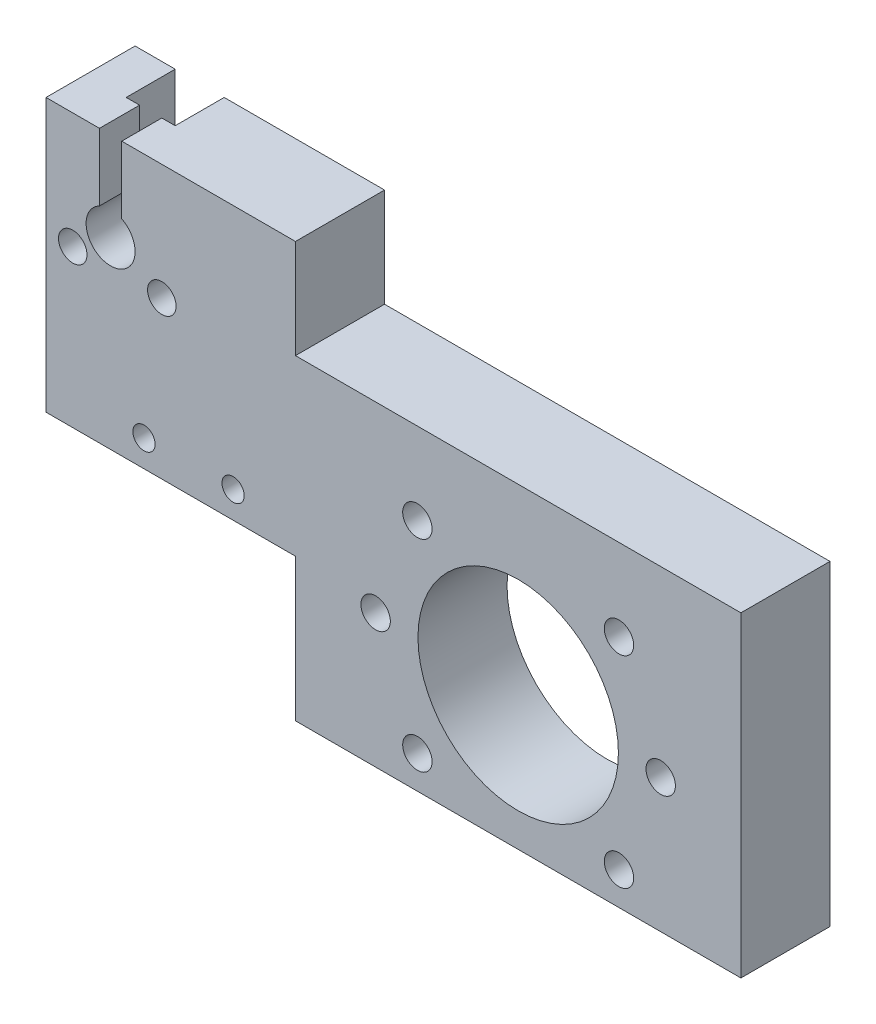
ISO-10303-21;
HEADER;
FILE_DESCRIPTION(('STEP AP214'),'2;1');
FILE_NAME('part.step','',(''),(''),'','','');
FILE_SCHEMA(('AUTOMOTIVE_DESIGN { 1 0 10303 214 1 1 1 1 }'));
ENDSEC;
DATA;
#1=APPLICATION_CONTEXT('core data for automotive mechanical design processes');
#2=APPLICATION_PROTOCOL_DEFINITION('international standard','automotive_design',2000,#1);
#3=PRODUCT_CONTEXT('',#1,'mechanical');
#4=PRODUCT('Part','Part','',(#3));
#5=PRODUCT_RELATED_PRODUCT_CATEGORY('part','',(#4));
#6=PRODUCT_DEFINITION_FORMATION('','',#4);
#7=PRODUCT_DEFINITION_CONTEXT('part definition',#1,'design');
#8=PRODUCT_DEFINITION('design','',#6,#7);
#9=PRODUCT_DEFINITION_SHAPE('','',#8);
#10=(LENGTH_UNIT() NAMED_UNIT(*) SI_UNIT(.MILLI.,.METRE.));
#11=(NAMED_UNIT(*) PLANE_ANGLE_UNIT() SI_UNIT($,.RADIAN.));
#12=(NAMED_UNIT(*) SI_UNIT($,.STERADIAN.) SOLID_ANGLE_UNIT());
#13=UNCERTAINTY_MEASURE_WITH_UNIT(LENGTH_MEASURE(1.E-05),#10,'distance_accuracy_value','');
#14=(GEOMETRIC_REPRESENTATION_CONTEXT(3) GLOBAL_UNCERTAINTY_ASSIGNED_CONTEXT((#13)) GLOBAL_UNIT_ASSIGNED_CONTEXT((#10,
#11,#12)) REPRESENTATION_CONTEXT('',''));
#15=CARTESIAN_POINT('',(0.,0.,0.));
#16=DIRECTION('',(0.,0.,1.));
#17=DIRECTION('',(1.,0.,0.));
#18=AXIS2_PLACEMENT_3D('',#15,#16,#17);
#19=CARTESIAN_POINT('',(-44.5,28.85,10.));
#20=DIRECTION('',(1.,0.,0.));
#21=DIRECTION('',(0.,0.,-1.));
#22=AXIS2_PLACEMENT_3D('',#19,#20,#21);
#23=PLANE('',#22);
#24=DIRECTION('',(0.,1.,0.));
#25=VECTOR('',#24,1.);
#26=CARTESIAN_POINT('',(-44.5,28.85,5.5));
#27=LINE('',#26,#25);
#28=CARTESIAN_POINT('',(-44.5,21.2994897427832,5.5));
#29=VERTEX_POINT('',#28);
#30=CARTESIAN_POINT('',(-44.5,28.85,5.5));
#31=VERTEX_POINT('',#30);
#32=EDGE_CURVE('E208',#29,#31,#27,.T.);
#33=ORIENTED_EDGE('',*,*,#32,.F.);
#34=DIRECTION('',(0.,0.,-1.));
#35=VECTOR('',#34,1.);
#36=CARTESIAN_POINT('',(-44.5,21.2994897427832,10.));
#37=LINE('',#36,#35);
#38=CARTESIAN_POINT('',(-44.5,21.2994897427832,10.));
#39=VERTEX_POINT('',#38);
#40=EDGE_CURVE('E432',#29,#39,#37,.F.);
#41=ORIENTED_EDGE('',*,*,#40,.T.);
#42=DIRECTION('',(0.,-1.,0.));
#43=VECTOR('',#42,1.);
#44=CARTESIAN_POINT('',(-44.5,28.85,10.));
#45=LINE('',#44,#43);
#46=CARTESIAN_POINT('',(-44.5,28.85,10.));
#47=VERTEX_POINT('',#46);
#48=EDGE_CURVE('E211',#47,#39,#45,.T.);
#49=ORIENTED_EDGE('',*,*,#48,.F.);
#50=DIRECTION('',(0.,0.,-1.));
#51=VECTOR('',#50,1.);
#52=CARTESIAN_POINT('',(-44.5,28.85,10.));
#53=LINE('',#52,#51);
#54=EDGE_CURVE('E219',#47,#31,#53,.T.);
#55=ORIENTED_EDGE('',*,*,#54,.T.);
#56=EDGE_LOOP('',(#33,#41,#49,#55));
#57=FACE_BOUND('',#56,.T.);
#58=ADVANCED_FACE('F43',(#57),#23,.F.);
#59=CARTESIAN_POINT('',(-47.,28.85,10.));
#60=DIRECTION('',(-1.,0.,0.));
#61=DIRECTION('',(0.,0.,1.));
#62=AXIS2_PLACEMENT_3D('',#59,#60,#61);
#63=PLANE('',#62);
#64=DIRECTION('',(0.,1.,0.));
#65=VECTOR('',#64,1.);
#66=CARTESIAN_POINT('',(-47.,28.85,10.));
#67=LINE('',#66,#65);
#68=CARTESIAN_POINT('',(-47.,21.2994897427832,10.));
#69=VERTEX_POINT('',#68);
#70=CARTESIAN_POINT('',(-47.,28.85,10.));
#71=VERTEX_POINT('',#70);
#72=EDGE_CURVE('E215',#69,#71,#67,.T.);
#73=ORIENTED_EDGE('',*,*,#72,.F.);
#74=DIRECTION('',(0.,0.,-1.));
#75=VECTOR('',#74,1.);
#76=CARTESIAN_POINT('',(-47.,21.2994897427832,10.));
#77=LINE('',#76,#75);
#78=CARTESIAN_POINT('',(-47.,21.2994897427832,5.5));
#79=VERTEX_POINT('',#78);
#80=EDGE_CURVE('E431',#69,#79,#77,.T.);
#81=ORIENTED_EDGE('',*,*,#80,.T.);
#82=DIRECTION('',(0.,-1.,0.));
#83=VECTOR('',#82,1.);
#84=CARTESIAN_POINT('',(-47.,28.85,5.5));
#85=LINE('',#84,#83);
#86=CARTESIAN_POINT('',(-47.,28.85,5.5));
#87=VERTEX_POINT('',#86);
#88=EDGE_CURVE('E201',#87,#79,#85,.T.);
#89=ORIENTED_EDGE('',*,*,#88,.F.);
#90=DIRECTION('',(0.,0.,-1.));
#91=VECTOR('',#90,1.);
#92=CARTESIAN_POINT('',(-47.,28.85,10.));
#93=LINE('',#92,#91);
#94=EDGE_CURVE('E218',#71,#87,#93,.T.);
#95=ORIENTED_EDGE('',*,*,#94,.F.);
#96=EDGE_LOOP('',(#73,#81,#89,#95));
#97=FACE_BOUND('',#96,.T.);
#98=ADVANCED_FACE('F447',(#97),#63,.F.);
#99=CARTESIAN_POINT('',(0.,28.85,0.));
#100=DIRECTION('',(0.,1.,0.));
#101=DIRECTION('',(0.,0.,1.));
#102=AXIS2_PLACEMENT_3D('',#99,#100,#101);
#103=PLANE('',#102);
#104=DIRECTION('',(0.,0.,-1.));
#105=VECTOR('',#104,1.);
#106=CARTESIAN_POINT('',(-43.,28.85,5.5));
#107=LINE('',#106,#105);
#108=CARTESIAN_POINT('',(-43.,28.85,5.5));
#109=VERTEX_POINT('',#108);
#110=CARTESIAN_POINT('',(-43.,28.85,0.));
#111=VERTEX_POINT('',#110);
#112=EDGE_CURVE('E198',#109,#111,#107,.T.);
#113=ORIENTED_EDGE('',*,*,#112,.F.);
#114=DIRECTION('',(1.,0.,0.));
#115=VECTOR('',#114,1.);
#116=CARTESIAN_POINT('',(-43.,28.85,5.5));
#117=LINE('',#116,#115);
#118=EDGE_CURVE('E402',#31,#109,#117,.T.);
#119=ORIENTED_EDGE('',*,*,#118,.F.);
#120=ORIENTED_EDGE('',*,*,#54,.F.);
#121=DIRECTION('',(1.,0.,0.));
#122=VECTOR('',#121,1.);
#123=CARTESIAN_POINT('',(-50.,28.85,10.));
#124=LINE('',#123,#122);
#125=CARTESIAN_POINT('',(-25.,28.85,10.));
#126=VERTEX_POINT('',#125);
#127=EDGE_CURVE('E231',#47,#126,#124,.T.);
#128=ORIENTED_EDGE('',*,*,#127,.T.);
#129=DIRECTION('',(0.,0.,-1.));
#130=VECTOR('',#129,1.);
#131=CARTESIAN_POINT('',(-25.,28.85,0.));
#132=LINE('',#131,#130);
#133=CARTESIAN_POINT('',(-25.,28.85,0.));
#134=VERTEX_POINT('',#133);
#135=EDGE_CURVE('E230',#126,#134,#132,.T.);
#136=ORIENTED_EDGE('',*,*,#135,.T.);
#137=DIRECTION('',(-1.,0.,0.));
#138=VECTOR('',#137,1.);
#139=CARTESIAN_POINT('',(-50.,28.85,0.));
#140=LINE('',#139,#138);
#141=EDGE_CURVE('E234',#134,#111,#140,.T.);
#142=ORIENTED_EDGE('',*,*,#141,.T.);
#143=EDGE_LOOP('',(#113,#119,#120,#128,#136,#142));
#144=FACE_BOUND('',#143,.T.);
#145=ADVANCED_FACE('F416',(#144),#103,.T.);
#146=CARTESIAN_POINT('',(-25.,17.75,10.));
#147=DIRECTION('',(0.,-1.,0.));
#148=DIRECTION('',(0.,0.,-1.));
#149=AXIS2_PLACEMENT_3D('',#146,#147,#148);
#150=PLANE('',#149);
#151=DIRECTION('',(0.,0.,-1.));
#152=VECTOR('',#151,1.);
#153=CARTESIAN_POINT('',(-25.,17.75,0.));
#154=LINE('',#153,#152);
#155=CARTESIAN_POINT('',(-25.,17.75,10.));
#156=VERTEX_POINT('',#155);
#157=CARTESIAN_POINT('',(-25.,17.75,0.));
#158=VERTEX_POINT('',#157);
#159=EDGE_CURVE('E67',#156,#158,#154,.T.);
#160=ORIENTED_EDGE('',*,*,#159,.F.);
#161=DIRECTION('',(-1.,0.,0.));
#162=VECTOR('',#161,1.);
#163=CARTESIAN_POINT('',(-25.,17.75,10.));
#164=LINE('',#163,#162);
#165=CARTESIAN_POINT('',(25.,17.75,10.));
#166=VERTEX_POINT('',#165);
#167=EDGE_CURVE('E337',#166,#156,#164,.T.);
#168=ORIENTED_EDGE('',*,*,#167,.F.);
#169=DIRECTION('',(0.,0.,-1.));
#170=VECTOR('',#169,1.);
#171=CARTESIAN_POINT('',(25.,17.75,10.));
#172=LINE('',#171,#170);
#173=CARTESIAN_POINT('',(25.,17.75,0.));
#174=VERTEX_POINT('',#173);
#175=EDGE_CURVE('E11',#166,#174,#172,.T.);
#176=ORIENTED_EDGE('',*,*,#175,.T.);
#177=DIRECTION('',(-1.,0.,0.));
#178=VECTOR('',#177,1.);
#179=CARTESIAN_POINT('',(-25.,17.75,0.));
#180=LINE('',#179,#178);
#181=EDGE_CURVE('E351',#174,#158,#180,.T.);
#182=ORIENTED_EDGE('',*,*,#181,.T.);
#183=EDGE_LOOP('',(#160,#168,#176,#182));
#184=FACE_BOUND('',#183,.T.);
#185=ADVANCED_FACE('F547',(#184),#150,.F.);
#186=CARTESIAN_POINT('',(-25.,17.75,10.));
#187=DIRECTION('',(1.,0.,0.));
#188=DIRECTION('',(0.,0.,-1.));
#189=AXIS2_PLACEMENT_3D('',#186,#187,#188);
#190=PLANE('',#189);
#191=DIRECTION('',(0.,0.,1.));
#192=VECTOR('',#191,1.);
#193=CARTESIAN_POINT('',(-25.,-1.75,0.));
#194=LINE('',#193,#192);
#195=CARTESIAN_POINT('',(-25.,-1.75,0.));
#196=VERTEX_POINT('',#195);
#197=CARTESIAN_POINT('',(-25.,-1.75,10.));
#198=VERTEX_POINT('',#197);
#199=EDGE_CURVE('E269',#196,#198,#194,.T.);
#200=ORIENTED_EDGE('',*,*,#199,.F.);
#201=DIRECTION('',(0.,-1.,0.));
#202=VECTOR('',#201,1.);
#203=CARTESIAN_POINT('',(-25.,17.75,0.));
#204=LINE('',#203,#202);
#205=CARTESIAN_POINT('',(-25.,-17.75,0.));
#206=VERTEX_POINT('',#205);
#207=EDGE_CURVE('E354',#196,#206,#204,.T.);
#208=ORIENTED_EDGE('',*,*,#207,.T.);
#209=DIRECTION('',(0.,0.,-1.));
#210=VECTOR('',#209,1.);
#211=CARTESIAN_POINT('',(-25.,-17.75,10.));
#212=LINE('',#211,#210);
#213=CARTESIAN_POINT('',(-25.,-17.75,10.));
#214=VERTEX_POINT('',#213);
#215=EDGE_CURVE('E52',#214,#206,#212,.T.);
#216=ORIENTED_EDGE('',*,*,#215,.F.);
#217=DIRECTION('',(0.,-1.,0.));
#218=VECTOR('',#217,1.);
#219=CARTESIAN_POINT('',(-25.,17.75,10.));
#220=LINE('',#219,#218);
#221=EDGE_CURVE('E341',#198,#214,#220,.T.);
#222=ORIENTED_EDGE('',*,*,#221,.F.);
#223=EDGE_LOOP('',(#200,#208,#216,#222));
#224=FACE_BOUND('',#223,.T.);
#225=ADVANCED_FACE('F381',(#224),#190,.F.);
#226=CARTESIAN_POINT('',(25.,17.75,10.));
#227=DIRECTION('',(-1.,0.,0.));
#228=DIRECTION('',(0.,0.,1.));
#229=AXIS2_PLACEMENT_3D('',#226,#227,#228);
#230=PLANE('',#229);
#231=DIRECTION('',(0.,1.,0.));
#232=VECTOR('',#231,1.);
#233=CARTESIAN_POINT('',(25.,17.75,0.));
#234=LINE('',#233,#232);
#235=CARTESIAN_POINT('',(25.,-17.75,0.));
#236=VERTEX_POINT('',#235);
#237=EDGE_CURVE('E329',#236,#174,#234,.T.);
#238=ORIENTED_EDGE('',*,*,#237,.T.);
#239=ORIENTED_EDGE('',*,*,#175,.F.);
#240=DIRECTION('',(0.,1.,0.));
#241=VECTOR('',#240,1.);
#242=CARTESIAN_POINT('',(25.,17.75,10.));
#243=LINE('',#242,#241);
#244=CARTESIAN_POINT('',(25.,-17.75,10.));
#245=VERTEX_POINT('',#244);
#246=EDGE_CURVE('E333',#245,#166,#243,.T.);
#247=ORIENTED_EDGE('',*,*,#246,.F.);
#248=DIRECTION('',(0.,0.,-1.));
#249=VECTOR('',#248,1.);
#250=CARTESIAN_POINT('',(25.,-17.75,10.));
#251=LINE('',#250,#249);
#252=EDGE_CURVE('E347',#245,#236,#251,.T.);
#253=ORIENTED_EDGE('',*,*,#252,.T.);
#254=EDGE_LOOP('',(#238,#239,#247,#253));
#255=FACE_BOUND('',#254,.T.);
#256=ADVANCED_FACE('F45',(#255),#230,.F.);
#257=CARTESIAN_POINT('',(-25.,-17.75,10.));
#258=DIRECTION('',(0.,1.,0.));
#259=DIRECTION('',(0.,0.,1.));
#260=AXIS2_PLACEMENT_3D('',#257,#258,#259);
#261=PLANE('',#260);
#262=DIRECTION('',(1.,0.,0.));
#263=VECTOR('',#262,1.);
#264=CARTESIAN_POINT('',(-25.,-17.75,0.));
#265=LINE('',#264,#263);
#266=EDGE_CURVE('E338',#206,#236,#265,.T.);
#267=ORIENTED_EDGE('',*,*,#266,.T.);
#268=ORIENTED_EDGE('',*,*,#252,.F.);
#269=DIRECTION('',(1.,0.,0.));
#270=VECTOR('',#269,1.);
#271=CARTESIAN_POINT('',(-25.,-17.75,10.));
#272=LINE('',#271,#270);
#273=EDGE_CURVE('E344',#214,#245,#272,.T.);
#274=ORIENTED_EDGE('',*,*,#273,.F.);
#275=ORIENTED_EDGE('',*,*,#215,.T.);
#276=EDGE_LOOP('',(#267,#268,#274,#275));
#277=FACE_BOUND('',#276,.T.);
#278=ADVANCED_FACE('F367',(#277),#261,.F.);
#279=CARTESIAN_POINT('',(0.,0.,10.));
#280=DIRECTION('',(0.,0.,1.));
#281=DIRECTION('',(1.,0.,0.));
#282=AXIS2_PLACEMENT_3D('',#279,#280,#281);
#283=PLANE('',#282);
#284=CARTESIAN_POINT('',(-40.,15.85,10.));
#285=DIRECTION('',(0.,0.,1.));
#286=DIRECTION('',(1.,0.,0.));
#287=AXIS2_PLACEMENT_3D('',#284,#285,#286);
#288=CIRCLE('',#287,1.6);
#289=CARTESIAN_POINT('',(-38.4,15.85,10.));
#290=VERTEX_POINT('',#289);
#291=EDGE_CURVE('E460',#290,#290,#288,.T.);
#292=ORIENTED_EDGE('',*,*,#291,.F.);
#293=EDGE_LOOP('',(#292));
#294=FACE_BOUND('',#293,.T.);
#295=CARTESIAN_POINT('',(-50.,15.85,10.));
#296=DIRECTION('',(0.,0.,1.));
#297=DIRECTION('',(1.,0.,0.));
#298=AXIS2_PLACEMENT_3D('',#295,#296,#297);
#299=CIRCLE('',#298,1.6);
#300=CARTESIAN_POINT('',(-48.4,15.85,10.));
#301=VERTEX_POINT('',#300);
#302=EDGE_CURVE('E456',#301,#301,#299,.T.);
#303=ORIENTED_EDGE('',*,*,#302,.F.);
#304=EDGE_LOOP('',(#303));
#305=FACE_BOUND('',#304,.T.);
#306=CARTESIAN_POINT('',(-45.75,18.85,10.));
#307=DIRECTION('',(0.,0.,-1.));
#308=DIRECTION('',(-1.,0.,0.));
#309=AXIS2_PLACEMENT_3D('',#306,#307,#308);
#310=CIRCLE('',#309,2.75);
#311=EDGE_CURVE('E170',#39,#69,#310,.T.);
#312=ORIENTED_EDGE('',*,*,#311,.T.);
#313=ORIENTED_EDGE('',*,*,#72,.T.);
#314=CARTESIAN_POINT('',(-53.,28.85,10.));
#315=VERTEX_POINT('',#314);
#316=EDGE_CURVE('E226',#315,#71,#124,.T.);
#317=ORIENTED_EDGE('',*,*,#316,.F.);
#318=DIRECTION('',(0.,1.,0.));
#319=VECTOR('',#318,1.);
#320=CARTESIAN_POINT('',(-53.,-1.75,10.));
#321=LINE('',#320,#319);
#322=CARTESIAN_POINT('',(-53.,-1.75,10.));
#323=VERTEX_POINT('',#322);
#324=EDGE_CURVE('E397',#323,#315,#321,.T.);
#325=ORIENTED_EDGE('',*,*,#324,.F.);
#326=DIRECTION('',(1.,0.,0.));
#327=VECTOR('',#326,1.);
#328=CARTESIAN_POINT('',(-25.,-1.75,10.));
#329=LINE('',#328,#327);
#330=EDGE_CURVE('E253',#323,#198,#329,.T.);
#331=ORIENTED_EDGE('',*,*,#330,.T.);
#332=ORIENTED_EDGE('',*,*,#221,.T.);
#333=ORIENTED_EDGE('',*,*,#273,.T.);
#334=ORIENTED_EDGE('',*,*,#246,.T.);
#335=ORIENTED_EDGE('',*,*,#167,.T.);
#336=DIRECTION('',(0.,-1.,0.));
#337=VECTOR('',#336,1.);
#338=CARTESIAN_POINT('',(-25.,28.85,10.));
#339=LINE('',#338,#337);
#340=EDGE_CURVE('E244',#126,#156,#339,.T.);
#341=ORIENTED_EDGE('',*,*,#340,.F.);
#342=ORIENTED_EDGE('',*,*,#127,.F.);
#343=ORIENTED_EDGE('',*,*,#48,.T.);
#344=EDGE_LOOP('',(#312,#313,#317,#325,#331,#332,#333,#334,#335,#341,#342,#343));
#345=FACE_BOUND('',#344,.T.);
#346=CARTESIAN_POINT('',(-42.,1.25,10.));
#347=DIRECTION('',(0.,0.,-1.));
#348=DIRECTION('',(-1.,0.,0.));
#349=AXIS2_PLACEMENT_3D('',#346,#347,#348);
#350=CIRCLE('',#349,1.25);
#351=CARTESIAN_POINT('',(-43.25,1.25,10.));
#352=VERTEX_POINT('',#351);
#353=EDGE_CURVE('E249',#352,#352,#350,.T.);
#354=ORIENTED_EDGE('',*,*,#353,.T.);
#355=EDGE_LOOP('',(#354));
#356=FACE_BOUND('',#355,.T.);
#357=CARTESIAN_POINT('',(-32.,1.25,10.));
#358=DIRECTION('',(0.,0.,-1.));
#359=DIRECTION('',(-1.,0.,0.));
#360=AXIS2_PLACEMENT_3D('',#357,#358,#359);
#361=CIRCLE('',#360,1.25);
#362=CARTESIAN_POINT('',(-33.25,1.25,10.));
#363=VERTEX_POINT('',#362);
#364=EDGE_CURVE('E248',#363,#363,#361,.T.);
#365=ORIENTED_EDGE('',*,*,#364,.T.);
#366=EDGE_LOOP('',(#365));
#367=FACE_BOUND('',#366,.T.);
#368=CARTESIAN_POINT('',(-16.,-2.75,10.));
#369=DIRECTION('',(0.,0.,1.));
#370=DIRECTION('',(1.,0.,0.));
#371=AXIS2_PLACEMENT_3D('',#368,#369,#370);
#372=CIRCLE('',#371,1.65);
#373=CARTESIAN_POINT('',(-14.35,-2.75,10.));
#374=VERTEX_POINT('',#373);
#375=EDGE_CURVE('E282',#374,#374,#372,.T.);
#376=ORIENTED_EDGE('',*,*,#375,.F.);
#377=EDGE_LOOP('',(#376));
#378=FACE_BOUND('',#377,.T.);
#379=CARTESIAN_POINT('',(-11.3137084989849,-14.0637084989846,10.));
#380=DIRECTION('',(0.,0.,1.));
#381=DIRECTION('',(1.,0.,0.));
#382=AXIS2_PLACEMENT_3D('',#379,#380,#381);
#383=CIRCLE('',#382,1.65);
#384=CARTESIAN_POINT('',(-9.6637084989849,-14.0637084989846,10.));
#385=VERTEX_POINT('',#384);
#386=EDGE_CURVE('E287',#385,#385,#383,.T.);
#387=ORIENTED_EDGE('',*,*,#386,.F.);
#388=EDGE_LOOP('',(#387));
#389=FACE_BOUND('',#388,.T.);
#390=CARTESIAN_POINT('',(11.3137084989847,-14.0637084989849,10.));
#391=DIRECTION('',(0.,0.,1.));
#392=DIRECTION('',(1.,0.,0.));
#393=AXIS2_PLACEMENT_3D('',#390,#391,#392);
#394=CIRCLE('',#393,1.65);
#395=CARTESIAN_POINT('',(12.9637084989847,-14.0637084989849,10.));
#396=VERTEX_POINT('',#395);
#397=EDGE_CURVE('E318',#396,#396,#394,.T.);
#398=ORIENTED_EDGE('',*,*,#397,.F.);
#399=EDGE_LOOP('',(#398));
#400=FACE_BOUND('',#399,.T.);
#401=CARTESIAN_POINT('',(16.,-2.75000000000011,10.));
#402=DIRECTION('',(0.,0.,1.));
#403=DIRECTION('',(1.,0.,0.));
#404=AXIS2_PLACEMENT_3D('',#401,#402,#403);
#405=CIRCLE('',#404,1.65);
#406=CARTESIAN_POINT('',(17.65,-2.75000000000011,10.));
#407=VERTEX_POINT('',#406);
#408=EDGE_CURVE('E310',#407,#407,#405,.T.);
#409=ORIENTED_EDGE('',*,*,#408,.F.);
#410=EDGE_LOOP('',(#409));
#411=FACE_BOUND('',#410,.T.);
#412=CARTESIAN_POINT('',(11.3137084989848,8.56370849898471,10.));
#413=DIRECTION('',(0.,0.,1.));
#414=DIRECTION('',(1.,0.,0.));
#415=AXIS2_PLACEMENT_3D('',#412,#413,#414);
#416=CIRCLE('',#415,1.65);
#417=CARTESIAN_POINT('',(12.9637084989848,8.56370849898471,10.));
#418=VERTEX_POINT('',#417);
#419=EDGE_CURVE('E302',#418,#418,#416,.T.);
#420=ORIENTED_EDGE('',*,*,#419,.F.);
#421=EDGE_LOOP('',(#420));
#422=FACE_BOUND('',#421,.T.);
#423=CARTESIAN_POINT('',(-11.3137084989847,8.56370849898478,10.));
#424=DIRECTION('',(0.,0.,1.));
#425=DIRECTION('',(1.,0.,0.));
#426=AXIS2_PLACEMENT_3D('',#423,#424,#425);
#427=CIRCLE('',#426,1.65);
#428=CARTESIAN_POINT('',(-9.66370849898474,8.56370849898478,10.));
#429=VERTEX_POINT('',#428);
#430=EDGE_CURVE('E286',#429,#429,#427,.T.);
#431=ORIENTED_EDGE('',*,*,#430,.F.);
#432=EDGE_LOOP('',(#431));
#433=FACE_BOUND('',#432,.T.);
#434=CARTESIAN_POINT('',(0.,-2.75,10.));
#435=DIRECTION('',(0.,0.,1.));
#436=DIRECTION('',(1.,0.,0.));
#437=AXIS2_PLACEMENT_3D('',#434,#435,#436);
#438=CIRCLE('',#437,11.25);
#439=CARTESIAN_POINT('',(11.25,-2.75,10.));
#440=VERTEX_POINT('',#439);
#441=EDGE_CURVE('E281',#440,#440,#438,.T.);
#442=ORIENTED_EDGE('',*,*,#441,.F.);
#443=EDGE_LOOP('',(#442));
#444=FACE_BOUND('',#443,.T.);
#445=ADVANCED_FACE('F377',(#294,#305,#345,#356,#367,#378,#389,#400,#411,#422,#433,#444),#283,.T.);
#446=CARTESIAN_POINT('',(0.,0.,0.));
#447=DIRECTION('',(0.,0.,1.));
#448=DIRECTION('',(1.,0.,0.));
#449=AXIS2_PLACEMENT_3D('',#446,#447,#448);
#450=PLANE('',#449);
#451=CARTESIAN_POINT('',(-40.,15.85,0.));
#452=DIRECTION('',(0.,0.,1.));
#453=DIRECTION('',(1.,0.,0.));
#454=AXIS2_PLACEMENT_3D('',#451,#452,#453);
#455=CIRCLE('',#454,1.6);
#456=CARTESIAN_POINT('',(-38.4,15.85,0.));
#457=VERTEX_POINT('',#456);
#458=EDGE_CURVE('E171',#457,#457,#455,.T.);
#459=ORIENTED_EDGE('',*,*,#458,.T.);
#460=EDGE_LOOP('',(#459));
#461=FACE_BOUND('',#460,.T.);
#462=CARTESIAN_POINT('',(-50.,15.85,0.));
#463=DIRECTION('',(0.,0.,1.));
#464=DIRECTION('',(1.,0.,0.));
#465=AXIS2_PLACEMENT_3D('',#462,#463,#464);
#466=CIRCLE('',#465,1.6);
#467=CARTESIAN_POINT('',(-48.4,15.85,0.));
#468=VERTEX_POINT('',#467);
#469=EDGE_CURVE('E452',#468,#468,#466,.T.);
#470=ORIENTED_EDGE('',*,*,#469,.T.);
#471=EDGE_LOOP('',(#470));
#472=FACE_BOUND('',#471,.T.);
#473=CARTESIAN_POINT('',(-42.,1.25,0.));
#474=DIRECTION('',(0.,0.,-1.));
#475=DIRECTION('',(-1.,0.,0.));
#476=AXIS2_PLACEMENT_3D('',#473,#474,#475);
#477=CIRCLE('',#476,1.25);
#478=CARTESIAN_POINT('',(-43.25,1.25,0.));
#479=VERTEX_POINT('',#478);
#480=EDGE_CURVE('E254',#479,#479,#477,.T.);
#481=ORIENTED_EDGE('',*,*,#480,.F.);
#482=EDGE_LOOP('',(#481));
#483=FACE_BOUND('',#482,.T.);
#484=CARTESIAN_POINT('',(-32.,1.25,0.));
#485=DIRECTION('',(0.,0.,-1.));
#486=DIRECTION('',(-1.,0.,0.));
#487=AXIS2_PLACEMENT_3D('',#484,#485,#486);
#488=CIRCLE('',#487,1.25);
#489=CARTESIAN_POINT('',(-33.25,1.25,0.));
#490=VERTEX_POINT('',#489);
#491=EDGE_CURVE('E258',#490,#490,#488,.T.);
#492=ORIENTED_EDGE('',*,*,#491,.F.);
#493=EDGE_LOOP('',(#492));
#494=FACE_BOUND('',#493,.T.);
#495=CARTESIAN_POINT('',(-16.,-2.75,0.));
#496=DIRECTION('',(0.,0.,1.));
#497=DIRECTION('',(1.,0.,0.));
#498=AXIS2_PLACEMENT_3D('',#495,#496,#497);
#499=CIRCLE('',#498,1.65);
#500=CARTESIAN_POINT('',(-14.35,-2.75,0.));
#501=VERTEX_POINT('',#500);
#502=EDGE_CURVE('E277',#501,#501,#499,.T.);
#503=ORIENTED_EDGE('',*,*,#502,.T.);
#504=EDGE_LOOP('',(#503));
#505=FACE_BOUND('',#504,.T.);
#506=CARTESIAN_POINT('',(-11.3137084989849,-14.0637084989846,0.));
#507=DIRECTION('',(0.,0.,1.));
#508=DIRECTION('',(1.,0.,0.));
#509=AXIS2_PLACEMENT_3D('',#506,#507,#508);
#510=CIRCLE('',#509,1.65);
#511=CARTESIAN_POINT('',(-9.6637084989849,-14.0637084989846,0.));
#512=VERTEX_POINT('',#511);
#513=EDGE_CURVE('E276',#512,#512,#510,.T.);
#514=ORIENTED_EDGE('',*,*,#513,.T.);
#515=EDGE_LOOP('',(#514));
#516=FACE_BOUND('',#515,.T.);
#517=CARTESIAN_POINT('',(11.3137084989847,-14.0637084989849,0.));
#518=DIRECTION('',(0.,0.,1.));
#519=DIRECTION('',(1.,0.,0.));
#520=AXIS2_PLACEMENT_3D('',#517,#518,#519);
#521=CIRCLE('',#520,1.65);
#522=CARTESIAN_POINT('',(12.9637084989847,-14.0637084989849,0.));
#523=VERTEX_POINT('',#522);
#524=EDGE_CURVE('E291',#523,#523,#521,.T.);
#525=ORIENTED_EDGE('',*,*,#524,.T.);
#526=EDGE_LOOP('',(#525));
#527=FACE_BOUND('',#526,.T.);
#528=CARTESIAN_POINT('',(16.,-2.75000000000011,0.));
#529=DIRECTION('',(0.,0.,1.));
#530=DIRECTION('',(1.,0.,0.));
#531=AXIS2_PLACEMENT_3D('',#528,#529,#530);
#532=CIRCLE('',#531,1.65);
#533=CARTESIAN_POINT('',(17.65,-2.75000000000011,0.));
#534=VERTEX_POINT('',#533);
#535=EDGE_CURVE('E314',#534,#534,#532,.T.);
#536=ORIENTED_EDGE('',*,*,#535,.T.);
#537=EDGE_LOOP('',(#536));
#538=FACE_BOUND('',#537,.T.);
#539=CARTESIAN_POINT('',(11.3137084989848,8.56370849898471,0.));
#540=DIRECTION('',(0.,0.,1.));
#541=DIRECTION('',(1.,0.,0.));
#542=AXIS2_PLACEMENT_3D('',#539,#540,#541);
#543=CIRCLE('',#542,1.65);
#544=CARTESIAN_POINT('',(12.9637084989848,8.56370849898471,0.));
#545=VERTEX_POINT('',#544);
#546=EDGE_CURVE('E306',#545,#545,#543,.T.);
#547=ORIENTED_EDGE('',*,*,#546,.T.);
#548=EDGE_LOOP('',(#547));
#549=FACE_BOUND('',#548,.T.);
#550=CARTESIAN_POINT('',(-11.3137084989847,8.56370849898478,0.));
#551=DIRECTION('',(0.,0.,1.));
#552=DIRECTION('',(1.,0.,0.));
#553=AXIS2_PLACEMENT_3D('',#550,#551,#552);
#554=CIRCLE('',#553,1.65);
#555=CARTESIAN_POINT('',(-9.66370849898474,8.56370849898478,0.));
#556=VERTEX_POINT('',#555);
#557=EDGE_CURVE('E298',#556,#556,#554,.T.);
#558=ORIENTED_EDGE('',*,*,#557,.T.);
#559=EDGE_LOOP('',(#558));
#560=FACE_BOUND('',#559,.T.);
#561=CARTESIAN_POINT('',(0.,-2.75,0.));
#562=DIRECTION('',(0.,0.,1.));
#563=DIRECTION('',(1.,0.,0.));
#564=AXIS2_PLACEMENT_3D('',#561,#562,#563);
#565=CIRCLE('',#564,11.25);
#566=CARTESIAN_POINT('',(11.25,-2.75,0.));
#567=VERTEX_POINT('',#566);
#568=EDGE_CURVE('E325',#567,#567,#565,.T.);
#569=ORIENTED_EDGE('',*,*,#568,.T.);
#570=EDGE_LOOP('',(#569));
#571=FACE_BOUND('',#570,.T.);
#572=DIRECTION('',(0.,1.,0.));
#573=VECTOR('',#572,1.);
#574=CARTESIAN_POINT('',(-48.5,28.85,0.));
#575=LINE('',#574,#573);
#576=CARTESIAN_POINT('',(-48.5,18.85,0.));
#577=VERTEX_POINT('',#576);
#578=CARTESIAN_POINT('',(-48.5,28.85,0.));
#579=VERTEX_POINT('',#578);
#580=EDGE_CURVE('E176',#577,#579,#575,.T.);
#581=ORIENTED_EDGE('',*,*,#580,.F.);
#582=CARTESIAN_POINT('',(-45.75,18.85,0.));
#583=DIRECTION('',(0.,0.,-1.));
#584=DIRECTION('',(-1.,0.,0.));
#585=AXIS2_PLACEMENT_3D('',#582,#583,#584);
#586=CIRCLE('',#585,2.75);
#587=CARTESIAN_POINT('',(-43.,18.85,0.));
#588=VERTEX_POINT('',#587);
#589=EDGE_CURVE('E158',#588,#577,#586,.T.);
#590=ORIENTED_EDGE('',*,*,#589,.F.);
#591=DIRECTION('',(0.,-1.,0.));
#592=VECTOR('',#591,1.);
#593=CARTESIAN_POINT('',(-43.,28.85,0.));
#594=LINE('',#593,#592);
#595=EDGE_CURVE('E188',#111,#588,#594,.T.);
#596=ORIENTED_EDGE('',*,*,#595,.F.);
#597=ORIENTED_EDGE('',*,*,#141,.F.);
#598=DIRECTION('',(0.,-1.,0.));
#599=VECTOR('',#598,1.);
#600=CARTESIAN_POINT('',(-25.,28.85,0.));
#601=LINE('',#600,#599);
#602=EDGE_CURVE('E238',#134,#158,#601,.T.);
#603=ORIENTED_EDGE('',*,*,#602,.T.);
#604=ORIENTED_EDGE('',*,*,#181,.F.);
#605=ORIENTED_EDGE('',*,*,#237,.F.);
#606=ORIENTED_EDGE('',*,*,#266,.F.);
#607=ORIENTED_EDGE('',*,*,#207,.F.);
#608=DIRECTION('',(1.,0.,0.));
#609=VECTOR('',#608,1.);
#610=CARTESIAN_POINT('',(-25.,-1.75,0.));
#611=LINE('',#610,#609);
#612=CARTESIAN_POINT('',(-53.,-1.75,0.));
#613=VERTEX_POINT('',#612);
#614=EDGE_CURVE('E265',#613,#196,#611,.T.);
#615=ORIENTED_EDGE('',*,*,#614,.F.);
#616=DIRECTION('',(0.,-1.,0.));
#617=VECTOR('',#616,1.);
#618=CARTESIAN_POINT('',(-53.,28.85,0.));
#619=LINE('',#618,#617);
#620=CARTESIAN_POINT('',(-53.,28.85,0.));
#621=VERTEX_POINT('',#620);
#622=EDGE_CURVE('E194',#621,#613,#619,.T.);
#623=ORIENTED_EDGE('',*,*,#622,.F.);
#624=EDGE_CURVE('E185',#579,#621,#140,.T.);
#625=ORIENTED_EDGE('',*,*,#624,.F.);
#626=EDGE_LOOP('',(#581,#590,#596,#597,#603,#604,#605,#606,#607,#615,#623,#625));
#627=FACE_BOUND('',#626,.T.);
#628=ADVANCED_FACE('F183',(#461,#472,#483,#494,#505,#516,#527,#538,#549,#560,#571,#627),#450,.F.);
#629=CARTESIAN_POINT('',(0.,-2.75,0.));
#630=DIRECTION('',(0.,0.,1.));
#631=DIRECTION('',(1.,0.,0.));
#632=AXIS2_PLACEMENT_3D('',#629,#630,#631);
#633=CYLINDRICAL_SURFACE('',#632,11.25);
#634=ORIENTED_EDGE('',*,*,#568,.F.);
#635=EDGE_LOOP('',(#634));
#636=FACE_BOUND('',#635,.T.);
#637=ORIENTED_EDGE('',*,*,#441,.T.);
#638=EDGE_LOOP('',(#637));
#639=FACE_BOUND('',#638,.T.);
#640=ADVANCED_FACE('F527',(#636,#639),#633,.F.);
#641=CARTESIAN_POINT('',(-11.3137084989847,8.56370849898478,0.));
#642=DIRECTION('',(0.,0.,1.));
#643=DIRECTION('',(1.,0.,0.));
#644=AXIS2_PLACEMENT_3D('',#641,#642,#643);
#645=CYLINDRICAL_SURFACE('',#644,1.65);
#646=ORIENTED_EDGE('',*,*,#557,.F.);
#647=EDGE_LOOP('',(#646));
#648=FACE_BOUND('',#647,.T.);
#649=ORIENTED_EDGE('',*,*,#430,.T.);
#650=EDGE_LOOP('',(#649));
#651=FACE_BOUND('',#650,.T.);
#652=ADVANCED_FACE('F523',(#648,#651),#645,.F.);
#653=CARTESIAN_POINT('',(11.3137084989848,8.56370849898471,0.));
#654=DIRECTION('',(0.,0.,1.));
#655=DIRECTION('',(1.,0.,0.));
#656=AXIS2_PLACEMENT_3D('',#653,#654,#655);
#657=CYLINDRICAL_SURFACE('',#656,1.65);
#658=ORIENTED_EDGE('',*,*,#546,.F.);
#659=EDGE_LOOP('',(#658));
#660=FACE_BOUND('',#659,.T.);
#661=ORIENTED_EDGE('',*,*,#419,.T.);
#662=EDGE_LOOP('',(#661));
#663=FACE_BOUND('',#662,.T.);
#664=ADVANCED_FACE('F526',(#660,#663),#657,.F.);
#665=CARTESIAN_POINT('',(16.,-2.75000000000011,0.));
#666=DIRECTION('',(0.,0.,1.));
#667=DIRECTION('',(1.,0.,0.));
#668=AXIS2_PLACEMENT_3D('',#665,#666,#667);
#669=CYLINDRICAL_SURFACE('',#668,1.65);
#670=ORIENTED_EDGE('',*,*,#535,.F.);
#671=EDGE_LOOP('',(#670));
#672=FACE_BOUND('',#671,.T.);
#673=ORIENTED_EDGE('',*,*,#408,.T.);
#674=EDGE_LOOP('',(#673));
#675=FACE_BOUND('',#674,.T.);
#676=ADVANCED_FACE('F531',(#672,#675),#669,.F.);
#677=CARTESIAN_POINT('',(11.3137084989847,-14.0637084989849,0.));
#678=DIRECTION('',(0.,0.,1.));
#679=DIRECTION('',(1.,0.,0.));
#680=AXIS2_PLACEMENT_3D('',#677,#678,#679);
#681=CYLINDRICAL_SURFACE('',#680,1.65);
#682=ORIENTED_EDGE('',*,*,#524,.F.);
#683=EDGE_LOOP('',(#682));
#684=FACE_BOUND('',#683,.T.);
#685=ORIENTED_EDGE('',*,*,#397,.T.);
#686=EDGE_LOOP('',(#685));
#687=FACE_BOUND('',#686,.T.);
#688=ADVANCED_FACE('F521',(#684,#687),#681,.F.);
#689=CARTESIAN_POINT('',(-11.3137084989849,-14.0637084989846,0.));
#690=DIRECTION('',(0.,0.,1.));
#691=DIRECTION('',(1.,0.,0.));
#692=AXIS2_PLACEMENT_3D('',#689,#690,#691);
#693=CYLINDRICAL_SURFACE('',#692,1.65);
#694=ORIENTED_EDGE('',*,*,#513,.F.);
#695=EDGE_LOOP('',(#694));
#696=FACE_BOUND('',#695,.T.);
#697=ORIENTED_EDGE('',*,*,#386,.T.);
#698=EDGE_LOOP('',(#697));
#699=FACE_BOUND('',#698,.T.);
#700=ADVANCED_FACE('F517',(#696,#699),#693,.F.);
#701=CARTESIAN_POINT('',(-16.,-2.75,0.));
#702=DIRECTION('',(0.,0.,1.));
#703=DIRECTION('',(1.,0.,0.));
#704=AXIS2_PLACEMENT_3D('',#701,#702,#703);
#705=CYLINDRICAL_SURFACE('',#704,1.65);
#706=ORIENTED_EDGE('',*,*,#502,.F.);
#707=EDGE_LOOP('',(#706));
#708=FACE_BOUND('',#707,.T.);
#709=ORIENTED_EDGE('',*,*,#375,.T.);
#710=EDGE_LOOP('',(#709));
#711=FACE_BOUND('',#710,.T.);
#712=ADVANCED_FACE('F514',(#708,#711),#705,.F.);
#713=CARTESIAN_POINT('',(-25.,-1.75,0.));
#714=DIRECTION('',(0.,-1.,0.));
#715=DIRECTION('',(1.,0.,0.));
#716=AXIS2_PLACEMENT_3D('',#713,#714,#715);
#717=PLANE('',#716);
#718=ORIENTED_EDGE('',*,*,#330,.F.);
#719=DIRECTION('',(0.,0.,1.));
#720=VECTOR('',#719,1.);
#721=CARTESIAN_POINT('',(-53.,-1.75,0.));
#722=LINE('',#721,#720);
#723=EDGE_CURVE('E386',#613,#323,#722,.T.);
#724=ORIENTED_EDGE('',*,*,#723,.F.);
#725=ORIENTED_EDGE('',*,*,#614,.T.);
#726=ORIENTED_EDGE('',*,*,#199,.T.);
#727=EDGE_LOOP('',(#718,#724,#725,#726));
#728=FACE_BOUND('',#727,.T.);
#729=ADVANCED_FACE('F383',(#728),#717,.T.);
#730=CARTESIAN_POINT('',(-32.,1.25,10.));
#731=DIRECTION('',(0.,0.,-1.));
#732=DIRECTION('',(-1.,0.,0.));
#733=AXIS2_PLACEMENT_3D('',#730,#731,#732);
#734=CYLINDRICAL_SURFACE('',#733,1.25);
#735=ORIENTED_EDGE('',*,*,#364,.F.);
#736=EDGE_LOOP('',(#735));
#737=FACE_BOUND('',#736,.T.);
#738=ORIENTED_EDGE('',*,*,#491,.T.);
#739=EDGE_LOOP('',(#738));
#740=FACE_BOUND('',#739,.T.);
#741=ADVANCED_FACE('F507',(#737,#740),#734,.F.);
#742=CARTESIAN_POINT('',(-42.,1.25,10.));
#743=DIRECTION('',(0.,0.,-1.));
#744=DIRECTION('',(-1.,0.,0.));
#745=AXIS2_PLACEMENT_3D('',#742,#743,#744);
#746=CYLINDRICAL_SURFACE('',#745,1.25);
#747=ORIENTED_EDGE('',*,*,#353,.F.);
#748=EDGE_LOOP('',(#747));
#749=FACE_BOUND('',#748,.T.);
#750=ORIENTED_EDGE('',*,*,#480,.T.);
#751=EDGE_LOOP('',(#750));
#752=FACE_BOUND('',#751,.T.);
#753=ADVANCED_FACE('F504',(#749,#752),#746,.F.);
#754=CARTESIAN_POINT('',(-25.,28.85,0.));
#755=DIRECTION('',(-1.,0.,0.));
#756=DIRECTION('',(0.,0.,1.));
#757=AXIS2_PLACEMENT_3D('',#754,#755,#756);
#758=PLANE('',#757);
#759=ORIENTED_EDGE('',*,*,#159,.T.);
#760=ORIENTED_EDGE('',*,*,#602,.F.);
#761=ORIENTED_EDGE('',*,*,#135,.F.);
#762=ORIENTED_EDGE('',*,*,#340,.T.);
#763=EDGE_LOOP('',(#759,#760,#761,#762));
#764=FACE_BOUND('',#763,.T.);
#765=ADVANCED_FACE('F421',(#764),#758,.F.);
#766=DIRECTION('',(0.,0.,-1.));
#767=VECTOR('',#766,1.);
#768=CARTESIAN_POINT('',(-48.5,28.85,5.5));
#769=LINE('',#768,#767);
#770=CARTESIAN_POINT('',(-48.5,28.85,5.5));
#771=VERTEX_POINT('',#770);
#772=EDGE_CURVE('E180',#771,#579,#769,.T.);
#773=ORIENTED_EDGE('',*,*,#772,.T.);
#774=ORIENTED_EDGE('',*,*,#624,.T.);
#775=DIRECTION('',(0.,0.,-1.));
#776=VECTOR('',#775,1.);
#777=CARTESIAN_POINT('',(-53.,28.85,10.));
#778=LINE('',#777,#776);
#779=EDGE_CURVE('E393',#315,#621,#778,.T.);
#780=ORIENTED_EDGE('',*,*,#779,.F.);
#781=ORIENTED_EDGE('',*,*,#316,.T.);
#782=ORIENTED_EDGE('',*,*,#94,.T.);
#783=EDGE_CURVE('E59',#771,#87,#117,.T.);
#784=ORIENTED_EDGE('',*,*,#783,.F.);
#785=EDGE_LOOP('',(#773,#774,#780,#781,#782,#784));
#786=FACE_BOUND('',#785,.T.);
#787=ADVANCED_FACE('F426',(#786),#103,.T.);
#788=CARTESIAN_POINT('',(0.,0.,5.5));
#789=DIRECTION('',(0.,0.,-1.));
#790=DIRECTION('',(-1.,0.,0.));
#791=AXIS2_PLACEMENT_3D('',#788,#789,#790);
#792=PLANE('',#791);
#793=CARTESIAN_POINT('',(-45.75,18.85,5.5));
#794=DIRECTION('',(0.,0.,-1.));
#795=DIRECTION('',(-1.,0.,0.));
#796=AXIS2_PLACEMENT_3D('',#793,#794,#795);
#797=CIRCLE('',#796,2.75);
#798=CARTESIAN_POINT('',(-48.5,18.85,5.5));
#799=VERTEX_POINT('',#798);
#800=EDGE_CURVE('E428',#799,#79,#797,.T.);
#801=ORIENTED_EDGE('',*,*,#800,.F.);
#802=DIRECTION('',(0.,1.,0.));
#803=VECTOR('',#802,1.);
#804=CARTESIAN_POINT('',(-48.5,28.85,5.5));
#805=LINE('',#804,#803);
#806=EDGE_CURVE('E178',#799,#771,#805,.T.);
#807=ORIENTED_EDGE('',*,*,#806,.T.);
#808=ORIENTED_EDGE('',*,*,#783,.T.);
#809=ORIENTED_EDGE('',*,*,#88,.T.);
#810=EDGE_LOOP('',(#801,#807,#808,#809));
#811=FACE_BOUND('',#810,.T.);
#812=ADVANCED_FACE('F427',(#811),#792,.T.);
#813=CARTESIAN_POINT('',(-48.5,28.85,5.5));
#814=DIRECTION('',(-1.,0.,0.));
#815=DIRECTION('',(0.,0.,1.));
#816=AXIS2_PLACEMENT_3D('',#813,#814,#815);
#817=PLANE('',#816);
#818=ORIENTED_EDGE('',*,*,#580,.T.);
#819=ORIENTED_EDGE('',*,*,#772,.F.);
#820=ORIENTED_EDGE('',*,*,#806,.F.);
#821=DIRECTION('',(0.,0.,-1.));
#822=VECTOR('',#821,1.);
#823=CARTESIAN_POINT('',(-48.5,18.85,5.5));
#824=LINE('',#823,#822);
#825=EDGE_CURVE('E161',#799,#577,#824,.T.);
#826=ORIENTED_EDGE('',*,*,#825,.T.);
#827=EDGE_LOOP('',(#818,#819,#820,#826));
#828=FACE_BOUND('',#827,.T.);
#829=ADVANCED_FACE('F175',(#828),#817,.F.);
#830=CARTESIAN_POINT('',(-45.75,18.85,5.5));
#831=DIRECTION('',(0.,0.,-1.));
#832=DIRECTION('',(-1.,0.,0.));
#833=AXIS2_PLACEMENT_3D('',#830,#831,#832);
#834=CIRCLE('',#833,2.75);
#835=CARTESIAN_POINT('',(-43.,18.85,5.5));
#836=VERTEX_POINT('',#835);
#837=EDGE_CURVE('E438',#29,#836,#834,.T.);
#838=ORIENTED_EDGE('',*,*,#837,.F.);
#839=ORIENTED_EDGE('',*,*,#32,.T.);
#840=ORIENTED_EDGE('',*,*,#118,.T.);
#841=DIRECTION('',(0.,-1.,0.));
#842=VECTOR('',#841,1.);
#843=CARTESIAN_POINT('',(-43.,28.85,5.5));
#844=LINE('',#843,#842);
#845=EDGE_CURVE('E187',#109,#836,#844,.T.);
#846=ORIENTED_EDGE('',*,*,#845,.T.);
#847=EDGE_LOOP('',(#838,#839,#840,#846));
#848=FACE_BOUND('',#847,.T.);
#849=ADVANCED_FACE('F409',(#848),#792,.T.);
#850=CARTESIAN_POINT('',(-43.,28.85,5.5));
#851=DIRECTION('',(1.,0.,0.));
#852=DIRECTION('',(0.,0.,-1.));
#853=AXIS2_PLACEMENT_3D('',#850,#851,#852);
#854=PLANE('',#853);
#855=ORIENTED_EDGE('',*,*,#595,.T.);
#856=DIRECTION('',(0.,0.,-1.));
#857=VECTOR('',#856,1.);
#858=CARTESIAN_POINT('',(-43.,18.85,5.5));
#859=LINE('',#858,#857);
#860=EDGE_CURVE('E164',#836,#588,#859,.T.);
#861=ORIENTED_EDGE('',*,*,#860,.F.);
#862=ORIENTED_EDGE('',*,*,#845,.F.);
#863=ORIENTED_EDGE('',*,*,#112,.T.);
#864=EDGE_LOOP('',(#855,#861,#862,#863));
#865=FACE_BOUND('',#864,.T.);
#866=ADVANCED_FACE('F415',(#865),#854,.F.);
#867=CARTESIAN_POINT('',(-53.,0.,0.));
#868=DIRECTION('',(-1.,0.,0.));
#869=DIRECTION('',(0.,0.,1.));
#870=AXIS2_PLACEMENT_3D('',#867,#868,#869);
#871=PLANE('',#870);
#872=ORIENTED_EDGE('',*,*,#723,.T.);
#873=ORIENTED_EDGE('',*,*,#324,.T.);
#874=ORIENTED_EDGE('',*,*,#779,.T.);
#875=ORIENTED_EDGE('',*,*,#622,.T.);
#876=EDGE_LOOP('',(#872,#873,#874,#875));
#877=FACE_BOUND('',#876,.T.);
#878=ADVANCED_FACE('F390',(#877),#871,.T.);
#879=CARTESIAN_POINT('',(-45.75,18.85,10.));
#880=DIRECTION('',(0.,0.,-1.));
#881=DIRECTION('',(-1.,0.,0.));
#882=AXIS2_PLACEMENT_3D('',#879,#880,#881);
#883=CYLINDRICAL_SURFACE('',#882,2.75);
#884=ORIENTED_EDGE('',*,*,#311,.F.);
#885=ORIENTED_EDGE('',*,*,#40,.F.);
#886=ORIENTED_EDGE('',*,*,#837,.T.);
#887=ORIENTED_EDGE('',*,*,#860,.T.);
#888=ORIENTED_EDGE('',*,*,#589,.T.);
#889=ORIENTED_EDGE('',*,*,#825,.F.);
#890=ORIENTED_EDGE('',*,*,#800,.T.);
#891=ORIENTED_EDGE('',*,*,#80,.F.);
#892=EDGE_LOOP('',(#884,#885,#886,#887,#888,#889,#890,#891));
#893=FACE_BOUND('',#892,.T.);
#894=ADVANCED_FACE('F160',(#893),#883,.F.);
#895=CARTESIAN_POINT('',(-50.,15.85,0.));
#896=DIRECTION('',(0.,0.,1.));
#897=DIRECTION('',(1.,0.,0.));
#898=AXIS2_PLACEMENT_3D('',#895,#896,#897);
#899=CYLINDRICAL_SURFACE('',#898,1.6);
#900=ORIENTED_EDGE('',*,*,#469,.F.);
#901=EDGE_LOOP('',(#900));
#902=FACE_BOUND('',#901,.T.);
#903=ORIENTED_EDGE('',*,*,#302,.T.);
#904=EDGE_LOOP('',(#903));
#905=FACE_BOUND('',#904,.T.);
#906=ADVANCED_FACE('F473',(#902,#905),#899,.F.);
#907=CARTESIAN_POINT('',(-40.,15.85,0.));
#908=DIRECTION('',(0.,0.,1.));
#909=DIRECTION('',(1.,0.,0.));
#910=AXIS2_PLACEMENT_3D('',#907,#908,#909);
#911=CYLINDRICAL_SURFACE('',#910,1.6);
#912=ORIENTED_EDGE('',*,*,#458,.F.);
#913=EDGE_LOOP('',(#912));
#914=FACE_BOUND('',#913,.T.);
#915=ORIENTED_EDGE('',*,*,#291,.T.);
#916=EDGE_LOOP('',(#915));
#917=FACE_BOUND('',#916,.T.);
#918=ADVANCED_FACE('F470',(#914,#917),#911,.F.);
#919=CLOSED_SHELL('',(#58,#98,#145,#185,#225,#256,#278,#445,#628,#640,#652,#664,#676,#688,#700,
#712,#729,#741,#753,#765,#787,#812,#829,#849,#866,#878,#894,#906,#918));
#920=MANIFOLD_SOLID_BREP('B2',#919);
#921=ADVANCED_BREP_SHAPE_REPRESENTATION('',(#18,#920),#14);
#922=SHAPE_DEFINITION_REPRESENTATION(#9,#921);
ENDSEC;
END-ISO-10303-21;
